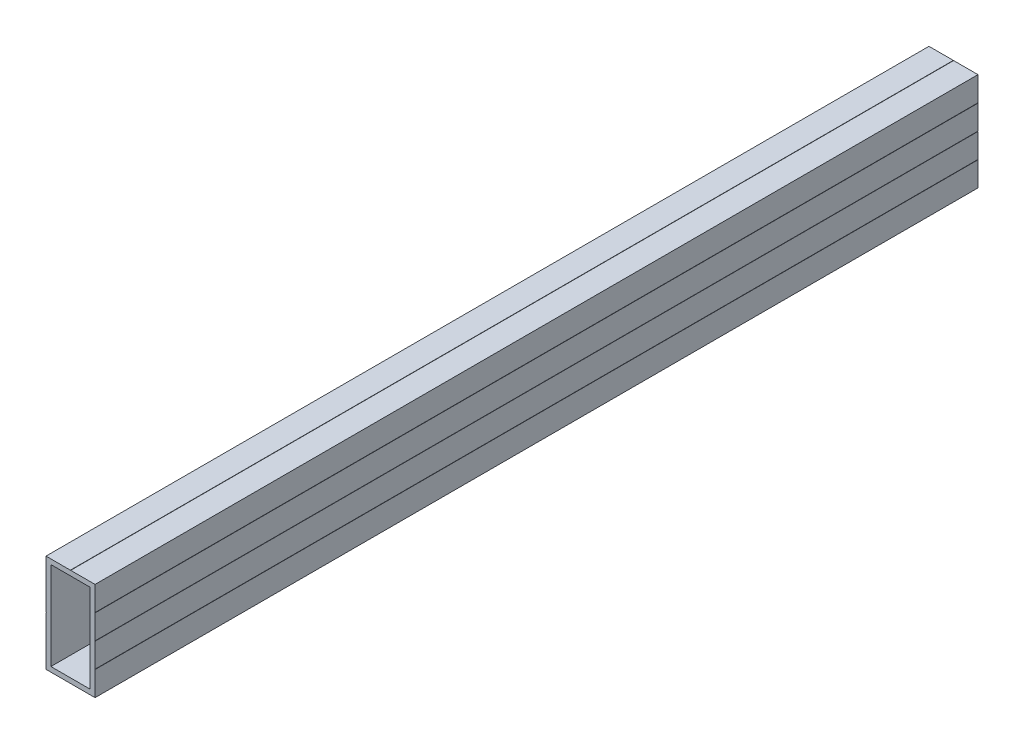
ISO-10303-21;
HEADER;
FILE_DESCRIPTION(('STEP AP214'),'2;1');
FILE_NAME('part.step','',(''),(''),'','','');
FILE_SCHEMA(('AUTOMOTIVE_DESIGN { 1 0 10303 214 1 1 1 1 }'));
ENDSEC;
DATA;
#1=APPLICATION_CONTEXT('core data for automotive mechanical design processes');
#2=APPLICATION_PROTOCOL_DEFINITION('international standard','automotive_design',2000,#1);
#3=PRODUCT_CONTEXT('',#1,'mechanical');
#4=PRODUCT('Part','Part','',(#3));
#5=PRODUCT_RELATED_PRODUCT_CATEGORY('part','',(#4));
#6=PRODUCT_DEFINITION_FORMATION('','',#4);
#7=PRODUCT_DEFINITION_CONTEXT('part definition',#1,'design');
#8=PRODUCT_DEFINITION('design','',#6,#7);
#9=PRODUCT_DEFINITION_SHAPE('','',#8);
#10=(LENGTH_UNIT() NAMED_UNIT(*) SI_UNIT(.MILLI.,.METRE.));
#11=(NAMED_UNIT(*) PLANE_ANGLE_UNIT() SI_UNIT($,.RADIAN.));
#12=(NAMED_UNIT(*) SI_UNIT($,.STERADIAN.) SOLID_ANGLE_UNIT());
#13=UNCERTAINTY_MEASURE_WITH_UNIT(LENGTH_MEASURE(1.E-05),#10,'distance_accuracy_value','');
#14=(GEOMETRIC_REPRESENTATION_CONTEXT(3) GLOBAL_UNCERTAINTY_ASSIGNED_CONTEXT((#13)) GLOBAL_UNIT_ASSIGNED_CONTEXT((#10,
#11,#12)) REPRESENTATION_CONTEXT('',''));
#15=CARTESIAN_POINT('',(0.,0.,0.));
#16=DIRECTION('',(0.,0.,1.));
#17=DIRECTION('',(1.,0.,0.));
#18=AXIS2_PLACEMENT_3D('',#15,#16,#17);
#19=CARTESIAN_POINT('',(-12.7,0.,0.));
#20=DIRECTION('',(1.,0.,0.));
#21=DIRECTION('',(0.,0.,-1.));
#22=AXIS2_PLACEMENT_3D('',#19,#20,#21);
#23=PLANE('',#22);
#24=DIRECTION('',(0.,0.,1.));
#25=VECTOR('',#24,1.);
#26=CARTESIAN_POINT('',(-12.7,25.4,-749.3));
#27=LINE('',#26,#25);
#28=CARTESIAN_POINT('',(-12.7,25.4,292.1));
#29=VERTEX_POINT('',#28);
#30=CARTESIAN_POINT('',(-12.7,25.4,749.3));
#31=VERTEX_POINT('',#30);
#32=EDGE_CURVE('E336',#29,#31,#27,.T.);
#33=ORIENTED_EDGE('',*,*,#32,.F.);
#34=DIRECTION('',(0.,-1.,0.));
#35=VECTOR('',#34,1.);
#36=CARTESIAN_POINT('',(-12.7,0.,292.1));
#37=LINE('',#36,#35);
#38=CARTESIAN_POINT('',(-12.7000000000132,12.7762,292.1));
#39=VERTEX_POINT('',#38);
#40=EDGE_CURVE('E409',#29,#39,#37,.T.);
#41=ORIENTED_EDGE('',*,*,#40,.T.);
#42=DIRECTION('',(0.,0.,1.));
#43=VECTOR('',#42,1.);
#44=CARTESIAN_POINT('',(-12.7000000000132,12.7762,-749.3));
#45=LINE('',#44,#43);
#46=CARTESIAN_POINT('',(-12.7000000000132,12.7762,749.3));
#47=VERTEX_POINT('',#46);
#48=EDGE_CURVE('E272',#39,#47,#45,.T.);
#49=ORIENTED_EDGE('',*,*,#48,.T.);
#50=DIRECTION('',(0.,-1.,0.));
#51=VECTOR('',#50,1.);
#52=CARTESIAN_POINT('',(-12.7,25.4,749.3));
#53=LINE('',#52,#51);
#54=EDGE_CURVE('E340',#31,#47,#53,.T.);
#55=ORIENTED_EDGE('',*,*,#54,.F.);
#56=EDGE_LOOP('',(#33,#41,#49,#55));
#57=FACE_BOUND('',#56,.T.);
#58=ADVANCED_FACE('F35',(#57),#23,.F.);
#59=DIRECTION('',(0.,0.,-1.));
#60=VECTOR('',#59,1.);
#61=CARTESIAN_POINT('',(-12.7,12.6238000000132,0.));
#62=LINE('',#61,#60);
#63=CARTESIAN_POINT('',(-12.7,12.6238000000132,292.1));
#64=VERTEX_POINT('',#63);
#65=CARTESIAN_POINT('',(-12.7,12.6238000000132,749.3));
#66=VERTEX_POINT('',#65);
#67=EDGE_CURVE('E274',#64,#66,#62,.F.);
#68=ORIENTED_EDGE('',*,*,#67,.F.);
#69=DIRECTION('',(0.,-1.,0.));
#70=VECTOR('',#69,1.);
#71=CARTESIAN_POINT('',(-12.7,0.,292.1));
#72=LINE('',#71,#70);
#73=CARTESIAN_POINT('',(-12.7,0.0761999999999976,292.1));
#74=VERTEX_POINT('',#73);
#75=EDGE_CURVE('E50',#64,#74,#72,.T.);
#76=ORIENTED_EDGE('',*,*,#75,.T.);
#77=DIRECTION('',(0.,0.,1.));
#78=VECTOR('',#77,1.);
#79=CARTESIAN_POINT('',(-12.7,0.0761999999999976,-749.3));
#80=LINE('',#79,#78);
#81=CARTESIAN_POINT('',(-12.7,0.0761999999999976,749.3));
#82=VERTEX_POINT('',#81);
#83=EDGE_CURVE('E280',#74,#82,#80,.T.);
#84=ORIENTED_EDGE('',*,*,#83,.T.);
#85=EDGE_CURVE('E344',#66,#82,#53,.T.);
#86=ORIENTED_EDGE('',*,*,#85,.F.);
#87=EDGE_LOOP('',(#68,#76,#84,#86));
#88=FACE_BOUND('',#87,.T.);
#89=ADVANCED_FACE('F514',(#88),#23,.F.);
#90=DIRECTION('',(0.,0.,-1.));
#91=VECTOR('',#90,1.);
#92=CARTESIAN_POINT('',(-12.7,-0.0761999999999985,0.));
#93=LINE('',#92,#91);
#94=CARTESIAN_POINT('',(-12.7,-0.0761999999999982,292.1));
#95=VERTEX_POINT('',#94);
#96=CARTESIAN_POINT('',(-12.7,-0.0761999999999985,749.3));
#97=VERTEX_POINT('',#96);
#98=EDGE_CURVE('E282',#95,#97,#93,.F.);
#99=ORIENTED_EDGE('',*,*,#98,.F.);
#100=DIRECTION('',(0.,-1.,0.));
#101=VECTOR('',#100,1.);
#102=CARTESIAN_POINT('',(-12.7,0.,292.1));
#103=LINE('',#102,#101);
#104=CARTESIAN_POINT('',(-12.7,-12.6238,292.1));
#105=VERTEX_POINT('',#104);
#106=EDGE_CURVE('E431',#95,#105,#103,.T.);
#107=ORIENTED_EDGE('',*,*,#106,.T.);
#108=DIRECTION('',(0.,0.,1.));
#109=VECTOR('',#108,1.);
#110=CARTESIAN_POINT('',(-12.7,-12.6238,-749.3));
#111=LINE('',#110,#109);
#112=CARTESIAN_POINT('',(-12.7,-12.6238,749.3));
#113=VERTEX_POINT('',#112);
#114=EDGE_CURVE('E291',#105,#113,#111,.T.);
#115=ORIENTED_EDGE('',*,*,#114,.T.);
#116=EDGE_CURVE('E597',#97,#113,#53,.T.);
#117=ORIENTED_EDGE('',*,*,#116,.F.);
#118=EDGE_LOOP('',(#99,#107,#115,#117));
#119=FACE_BOUND('',#118,.T.);
#120=ADVANCED_FACE('F506',(#119),#23,.F.);
#121=CARTESIAN_POINT('',(-12.7,-25.4,749.3));
#122=DIRECTION('',(0.,-1.,0.));
#123=DIRECTION('',(0.,0.,-1.));
#124=AXIS2_PLACEMENT_3D('',#121,#122,#123);
#125=PLANE('',#124);
#126=DIRECTION('',(-1.,0.,0.));
#127=VECTOR('',#126,1.);
#128=CARTESIAN_POINT('',(-12.7,-25.4,292.1));
#129=LINE('',#128,#127);
#130=CARTESIAN_POINT('',(-0.0762000000000089,-25.4,292.1));
#131=VERTEX_POINT('',#130);
#132=CARTESIAN_POINT('',(-12.7,-25.4,292.1));
#133=VERTEX_POINT('',#132);
#134=EDGE_CURVE('E453',#131,#133,#129,.T.);
#135=ORIENTED_EDGE('',*,*,#134,.F.);
#136=DIRECTION('',(0.,0.,1.));
#137=VECTOR('',#136,1.);
#138=CARTESIAN_POINT('',(-0.0762000000000087,-25.4,-749.3));
#139=LINE('',#138,#137);
#140=CARTESIAN_POINT('',(-0.0762000000000087,-25.4,749.3));
#141=VERTEX_POINT('',#140);
#142=EDGE_CURVE('E297',#131,#141,#139,.T.);
#143=ORIENTED_EDGE('',*,*,#142,.T.);
#144=DIRECTION('',(1.,0.,0.));
#145=VECTOR('',#144,1.);
#146=CARTESIAN_POINT('',(-12.7,-25.4,749.3));
#147=LINE('',#146,#145);
#148=CARTESIAN_POINT('',(-12.7,-25.4,749.3));
#149=VERTEX_POINT('',#148);
#150=EDGE_CURVE('E43',#149,#141,#147,.T.);
#151=ORIENTED_EDGE('',*,*,#150,.F.);
#152=DIRECTION('',(0.,0.,-1.));
#153=VECTOR('',#152,1.);
#154=CARTESIAN_POINT('',(-12.7,-25.4,749.3));
#155=LINE('',#154,#153);
#156=EDGE_CURVE('E343',#149,#133,#155,.T.);
#157=ORIENTED_EDGE('',*,*,#156,.T.);
#158=EDGE_LOOP('',(#135,#143,#151,#157));
#159=FACE_BOUND('',#158,.T.);
#160=ADVANCED_FACE('F511',(#159),#125,.T.);
#161=CARTESIAN_POINT('',(12.7,0.,0.));
#162=DIRECTION('',(1.,0.,0.));
#163=DIRECTION('',(0.,0.,-1.));
#164=AXIS2_PLACEMENT_3D('',#161,#162,#163);
#165=PLANE('',#164);
#166=DIRECTION('',(0.,-1.,0.));
#167=VECTOR('',#166,1.);
#168=CARTESIAN_POINT('',(12.7,0.,292.1));
#169=LINE('',#168,#167);
#170=CARTESIAN_POINT('',(12.7,-12.7762,292.1));
#171=VERTEX_POINT('',#170);
#172=CARTESIAN_POINT('',(12.7,-25.4,292.1));
#173=VERTEX_POINT('',#172);
#174=EDGE_CURVE('E477',#171,#173,#169,.T.);
#175=ORIENTED_EDGE('',*,*,#174,.F.);
#176=DIRECTION('',(0.,0.,1.));
#177=VECTOR('',#176,1.);
#178=CARTESIAN_POINT('',(12.7,-12.7762,-749.3));
#179=LINE('',#178,#177);
#180=CARTESIAN_POINT('',(12.7,-12.7762,749.3));
#181=VERTEX_POINT('',#180);
#182=EDGE_CURVE('E306',#171,#181,#179,.T.);
#183=ORIENTED_EDGE('',*,*,#182,.T.);
#184=DIRECTION('',(0.,-1.,0.));
#185=VECTOR('',#184,1.);
#186=CARTESIAN_POINT('',(12.7,25.4,749.3));
#187=LINE('',#186,#185);
#188=CARTESIAN_POINT('',(12.7,-25.4,749.3));
#189=VERTEX_POINT('',#188);
#190=EDGE_CURVE('E350',#181,#189,#187,.T.);
#191=ORIENTED_EDGE('',*,*,#190,.T.);
#192=DIRECTION('',(0.,0.,-1.));
#193=VECTOR('',#192,1.);
#194=CARTESIAN_POINT('',(12.7,-25.4,749.3));
#195=LINE('',#194,#193);
#196=EDGE_CURVE('E339',#189,#173,#195,.T.);
#197=ORIENTED_EDGE('',*,*,#196,.T.);
#198=EDGE_LOOP('',(#175,#183,#191,#197));
#199=FACE_BOUND('',#198,.T.);
#200=ADVANCED_FACE('F526',(#199),#165,.T.);
#201=DIRECTION('',(0.,-1.,0.));
#202=VECTOR('',#201,1.);
#203=CARTESIAN_POINT('',(12.7,0.,292.1));
#204=LINE('',#203,#202);
#205=CARTESIAN_POINT('',(12.7,-0.0762000000000003,292.1));
#206=VERTEX_POINT('',#205);
#207=CARTESIAN_POINT('',(12.7,-12.6238,292.1));
#208=VERTEX_POINT('',#207);
#209=EDGE_CURVE('E464',#206,#208,#204,.T.);
#210=ORIENTED_EDGE('',*,*,#209,.F.);
#211=DIRECTION('',(0.,0.,1.));
#212=VECTOR('',#211,1.);
#213=CARTESIAN_POINT('',(12.7,-0.0762000000000003,-749.3));
#214=LINE('',#213,#212);
#215=CARTESIAN_POINT('',(12.7,-0.0762000000000003,749.3));
#216=VERTEX_POINT('',#215);
#217=EDGE_CURVE('E314',#206,#216,#214,.T.);
#218=ORIENTED_EDGE('',*,*,#217,.T.);
#219=CARTESIAN_POINT('',(12.7,-12.6238,749.3));
#220=VERTEX_POINT('',#219);
#221=EDGE_CURVE('E558',#216,#220,#187,.T.);
#222=ORIENTED_EDGE('',*,*,#221,.T.);
#223=DIRECTION('',(0.,0.,-1.));
#224=VECTOR('',#223,1.);
#225=CARTESIAN_POINT('',(12.7,-12.6238,0.));
#226=LINE('',#225,#224);
#227=EDGE_CURVE('E308',#208,#220,#226,.F.);
#228=ORIENTED_EDGE('',*,*,#227,.F.);
#229=EDGE_LOOP('',(#210,#218,#222,#228));
#230=FACE_BOUND('',#229,.T.);
#231=ADVANCED_FACE('F535',(#230),#165,.T.);
#232=DIRECTION('',(0.,-1.,0.));
#233=VECTOR('',#232,1.);
#234=CARTESIAN_POINT('',(12.7,0.,292.1));
#235=LINE('',#234,#233);
#236=CARTESIAN_POINT('',(12.6999999999868,12.6238,292.1));
#237=VERTEX_POINT('',#236);
#238=CARTESIAN_POINT('',(12.7,0.0761999999999985,292.1));
#239=VERTEX_POINT('',#238);
#240=EDGE_CURVE('E451',#237,#239,#235,.T.);
#241=ORIENTED_EDGE('',*,*,#240,.F.);
#242=DIRECTION('',(0.,0.,1.));
#243=VECTOR('',#242,1.);
#244=CARTESIAN_POINT('',(12.6999999999868,12.6238,-749.3));
#245=LINE('',#244,#243);
#246=CARTESIAN_POINT('',(12.6999999999868,12.6238,749.3));
#247=VERTEX_POINT('',#246);
#248=EDGE_CURVE('E325',#237,#247,#245,.T.);
#249=ORIENTED_EDGE('',*,*,#248,.T.);
#250=CARTESIAN_POINT('',(12.7,0.0761999999999985,749.3));
#251=VERTEX_POINT('',#250);
#252=EDGE_CURVE('E354',#247,#251,#187,.T.);
#253=ORIENTED_EDGE('',*,*,#252,.T.);
#254=DIRECTION('',(0.,0.,-1.));
#255=VECTOR('',#254,1.);
#256=CARTESIAN_POINT('',(12.7,0.0761999999999985,0.));
#257=LINE('',#256,#255);
#258=EDGE_CURVE('E316',#239,#251,#257,.F.);
#259=ORIENTED_EDGE('',*,*,#258,.F.);
#260=EDGE_LOOP('',(#241,#249,#253,#259));
#261=FACE_BOUND('',#260,.T.);
#262=ADVANCED_FACE('F527',(#261),#165,.T.);
#263=CARTESIAN_POINT('',(-12.7,25.4,-749.3));
#264=DIRECTION('',(0.,1.,0.));
#265=DIRECTION('',(0.,0.,1.));
#266=AXIS2_PLACEMENT_3D('',#263,#264,#265);
#267=PLANE('',#266);
#268=DIRECTION('',(1.,0.,0.));
#269=VECTOR('',#268,1.);
#270=CARTESIAN_POINT('',(-12.7,25.4,292.1));
#271=LINE('',#270,#269);
#272=CARTESIAN_POINT('',(0.0761999999999968,25.4,292.1));
#273=VERTEX_POINT('',#272);
#274=CARTESIAN_POINT('',(12.7,25.4,292.1));
#275=VERTEX_POINT('',#274);
#276=EDGE_CURVE('E429',#273,#275,#271,.T.);
#277=ORIENTED_EDGE('',*,*,#276,.F.);
#278=DIRECTION('',(0.,0.,1.));
#279=VECTOR('',#278,1.);
#280=CARTESIAN_POINT('',(0.0761999999999968,25.4,-749.3));
#281=LINE('',#280,#279);
#282=CARTESIAN_POINT('',(0.0761999999999968,25.4,749.3));
#283=VERTEX_POINT('',#282);
#284=EDGE_CURVE('E330',#273,#283,#281,.T.);
#285=ORIENTED_EDGE('',*,*,#284,.T.);
#286=DIRECTION('',(1.,0.,0.));
#287=VECTOR('',#286,1.);
#288=CARTESIAN_POINT('',(-12.7,25.4,749.3));
#289=LINE('',#288,#287);
#290=CARTESIAN_POINT('',(12.7,25.4,749.3));
#291=VERTEX_POINT('',#290);
#292=EDGE_CURVE('E347',#283,#291,#289,.T.);
#293=ORIENTED_EDGE('',*,*,#292,.T.);
#294=DIRECTION('',(0.,0.,1.));
#295=VECTOR('',#294,1.);
#296=CARTESIAN_POINT('',(12.7,25.4,-749.3));
#297=LINE('',#296,#295);
#298=EDGE_CURVE('E348',#275,#291,#297,.T.);
#299=ORIENTED_EDGE('',*,*,#298,.F.);
#300=EDGE_LOOP('',(#277,#285,#293,#299));
#301=FACE_BOUND('',#300,.T.);
#302=ADVANCED_FACE('F538',(#301),#267,.T.);
#303=DIRECTION('',(1.,0.,0.));
#304=VECTOR('',#303,1.);
#305=CARTESIAN_POINT('',(-12.7,25.4,292.1));
#306=LINE('',#305,#304);
#307=CARTESIAN_POINT('',(-0.0761999999999985,25.4,292.1));
#308=VERTEX_POINT('',#307);
#309=EDGE_CURVE('E414',#29,#308,#306,.T.);
#310=ORIENTED_EDGE('',*,*,#309,.F.);
#311=ORIENTED_EDGE('',*,*,#32,.T.);
#312=CARTESIAN_POINT('',(-0.0761999999999985,25.4,749.3));
#313=VERTEX_POINT('',#312);
#314=EDGE_CURVE('E360',#31,#313,#289,.T.);
#315=ORIENTED_EDGE('',*,*,#314,.T.);
#316=DIRECTION('',(0.,0.,1.));
#317=VECTOR('',#316,1.);
#318=CARTESIAN_POINT('',(-0.0761999999999985,25.4,-749.3));
#319=LINE('',#318,#317);
#320=EDGE_CURVE('E332',#308,#313,#319,.T.);
#321=ORIENTED_EDGE('',*,*,#320,.F.);
#322=EDGE_LOOP('',(#310,#311,#315,#321));
#323=FACE_BOUND('',#322,.T.);
#324=ADVANCED_FACE('F508',(#323),#267,.T.);
#325=DIRECTION('',(-1.,0.,0.));
#326=VECTOR('',#325,1.);
#327=CARTESIAN_POINT('',(-12.7,-25.4,292.1));
#328=LINE('',#327,#326);
#329=CARTESIAN_POINT('',(0.0761999999999916,-25.4,292.1));
#330=VERTEX_POINT('',#329);
#331=EDGE_CURVE('E475',#173,#330,#328,.T.);
#332=ORIENTED_EDGE('',*,*,#331,.F.);
#333=ORIENTED_EDGE('',*,*,#196,.F.);
#334=CARTESIAN_POINT('',(0.0761999999999898,-25.4,749.3));
#335=VERTEX_POINT('',#334);
#336=EDGE_CURVE('E359',#335,#189,#147,.T.);
#337=ORIENTED_EDGE('',*,*,#336,.F.);
#338=DIRECTION('',(0.,0.,1.));
#339=VECTOR('',#338,1.);
#340=CARTESIAN_POINT('',(0.0761999999999916,-25.4,-749.3));
#341=LINE('',#340,#339);
#342=EDGE_CURVE('E301',#330,#335,#341,.T.);
#343=ORIENTED_EDGE('',*,*,#342,.F.);
#344=EDGE_LOOP('',(#332,#333,#337,#343));
#345=FACE_BOUND('',#344,.T.);
#346=ADVANCED_FACE('F496',(#345),#125,.T.);
#347=CARTESIAN_POINT('',(-12.7,25.4,749.3));
#348=DIRECTION('',(0.,0.,1.));
#349=DIRECTION('',(1.,0.,0.));
#350=AXIS2_PLACEMENT_3D('',#347,#348,#349);
#351=PLANE('',#350);
#352=DIRECTION('',(1.,0.,0.));
#353=VECTOR('',#352,1.);
#354=CARTESIAN_POINT('',(-10.16,-22.86,749.3));
#355=LINE('',#354,#353);
#356=CARTESIAN_POINT('',(-10.16,-22.86,749.3));
#357=VERTEX_POINT('',#356);
#358=CARTESIAN_POINT('',(10.16,-22.86,749.3));
#359=VERTEX_POINT('',#358);
#360=EDGE_CURVE('E479',#357,#359,#355,.T.);
#361=ORIENTED_EDGE('',*,*,#360,.F.);
#362=DIRECTION('',(0.,-1.,0.));
#363=VECTOR('',#362,1.);
#364=CARTESIAN_POINT('',(-10.16,22.86,749.3));
#365=LINE('',#364,#363);
#366=CARTESIAN_POINT('',(-10.16,22.86,749.3));
#367=VERTEX_POINT('',#366);
#368=EDGE_CURVE('E264',#367,#357,#365,.T.);
#369=ORIENTED_EDGE('',*,*,#368,.F.);
#370=DIRECTION('',(-1.,0.,0.));
#371=VECTOR('',#370,1.);
#372=CARTESIAN_POINT('',(10.16,22.86,749.3));
#373=LINE('',#372,#371);
#374=CARTESIAN_POINT('',(10.16,22.86,749.3));
#375=VERTEX_POINT('',#374);
#376=EDGE_CURVE('E483',#375,#367,#373,.T.);
#377=ORIENTED_EDGE('',*,*,#376,.F.);
#378=DIRECTION('',(0.,1.,0.));
#379=VECTOR('',#378,1.);
#380=CARTESIAN_POINT('',(10.16,-22.86,749.3));
#381=LINE('',#380,#379);
#382=EDGE_CURVE('E258',#359,#375,#381,.T.);
#383=ORIENTED_EDGE('',*,*,#382,.F.);
#384=EDGE_LOOP('',(#361,#369,#377,#383));
#385=FACE_BOUND('',#384,.T.);
#386=DIRECTION('',(-0.707106781186539,0.707106781186555,0.));
#387=VECTOR('',#386,1.);
#388=CARTESIAN_POINT('',(-12.5476000000263,12.6238000000132,749.3));
#389=LINE('',#388,#387);
#390=CARTESIAN_POINT('',(-12.6238000000066,12.6999999999934,749.3));
#391=VERTEX_POINT('',#390);
#392=EDGE_CURVE('E268',#391,#47,#389,.T.);
#393=ORIENTED_EDGE('',*,*,#392,.F.);
#394=DIRECTION('',(-0.707106781247692,-0.707106781125403,0.));
#395=VECTOR('',#394,1.);
#396=CARTESIAN_POINT('',(-6.3119000000066,19.0118999989018,749.3));
#397=LINE('',#396,#395);
#398=EDGE_CURVE('E271',#66,#391,#397,.F.);
#399=ORIENTED_EDGE('',*,*,#398,.F.);
#400=ORIENTED_EDGE('',*,*,#85,.T.);
#401=DIRECTION('',(-1.,0.,0.));
#402=VECTOR('',#401,1.);
#403=CARTESIAN_POINT('',(-12.5476,0.0761999999999985,749.3));
#404=LINE('',#403,#402);
#405=CARTESIAN_POINT('',(-12.5475999999737,0.0761999999999985,749.3));
#406=VERTEX_POINT('',#405);
#407=EDGE_CURVE('E275',#406,#82,#404,.T.);
#408=ORIENTED_EDGE('',*,*,#407,.F.);
#409=DIRECTION('',(-0.707106781247692,-0.707106781125403,0.));
#410=VECTOR('',#409,1.);
#411=CARTESIAN_POINT('',(0.0380999999999923,12.661899997797,749.3));
#412=LINE('',#411,#410);
#413=EDGE_CURVE('E278',#97,#406,#412,.F.);
#414=ORIENTED_EDGE('',*,*,#413,.F.);
#415=ORIENTED_EDGE('',*,*,#116,.T.);
#416=DIRECTION('',(-0.707106781186551,0.707106781186543,0.));
#417=VECTOR('',#416,1.);
#418=CARTESIAN_POINT('',(-12.5476,-12.7762,749.3));
#419=LINE('',#418,#417);
#420=CARTESIAN_POINT('',(-12.6238,-12.7,749.3));
#421=VERTEX_POINT('',#420);
#422=EDGE_CURVE('E283',#421,#113,#419,.T.);
#423=ORIENTED_EDGE('',*,*,#422,.F.);
#424=DIRECTION('',(-0.707106781186537,-0.707106781186558,0.));
#425=VECTOR('',#424,1.);
#426=CARTESIAN_POINT('',(6.38809999999999,6.31190000000056,749.3));
#427=LINE('',#426,#425);
#428=CARTESIAN_POINT('',(-12.7,-12.7762,749.3));
#429=VERTEX_POINT('',#428);
#430=EDGE_CURVE('E286',#429,#421,#427,.F.);
#431=ORIENTED_EDGE('',*,*,#430,.F.);
#432=EDGE_CURVE('E338',#429,#149,#53,.T.);
#433=ORIENTED_EDGE('',*,*,#432,.T.);
#434=ORIENTED_EDGE('',*,*,#150,.T.);
#435=DIRECTION('',(0.707106781186552,0.707106781186544,0.));
#436=VECTOR('',#435,1.);
#437=CARTESIAN_POINT('',(19.0118999999999,-6.31190000000029,749.3));
#438=LINE('',#437,#436);
#439=CARTESIAN_POINT('',(0.,-25.3238,749.3));
#440=VERTEX_POINT('',#439);
#441=EDGE_CURVE('E296',#440,#141,#438,.F.);
#442=ORIENTED_EDGE('',*,*,#441,.F.);
#443=DIRECTION('',(-0.707106781186547,0.707106781186548,0.));
#444=VECTOR('',#443,1.);
#445=CARTESIAN_POINT('',(0.0761999999999916,-25.4,749.3));
#446=LINE('',#445,#444);
#447=EDGE_CURVE('E293',#335,#440,#446,.T.);
#448=ORIENTED_EDGE('',*,*,#447,.F.);
#449=ORIENTED_EDGE('',*,*,#336,.T.);
#450=ORIENTED_EDGE('',*,*,#190,.F.);
#451=DIRECTION('',(0.707106781186539,-0.707106781186556,0.));
#452=VECTOR('',#451,1.);
#453=CARTESIAN_POINT('',(12.5476,-12.6238,749.3));
#454=LINE('',#453,#452);
#455=CARTESIAN_POINT('',(12.6238,-12.7,749.3));
#456=VERTEX_POINT('',#455);
#457=EDGE_CURVE('E299',#456,#181,#454,.T.);
#458=ORIENTED_EDGE('',*,*,#457,.F.);
#459=DIRECTION('',(0.707106781186553,0.707106781186542,0.));
#460=VECTOR('',#459,1.);
#461=CARTESIAN_POINT('',(19.0118999999998,-6.3119000000003,749.3));
#462=LINE('',#461,#460);
#463=EDGE_CURVE('E305',#220,#456,#462,.F.);
#464=ORIENTED_EDGE('',*,*,#463,.F.);
#465=ORIENTED_EDGE('',*,*,#221,.F.);
#466=DIRECTION('',(1.,0.,0.));
#467=VECTOR('',#466,1.);
#468=CARTESIAN_POINT('',(12.5476,-0.0761999999999985,749.3));
#469=LINE('',#468,#467);
#470=CARTESIAN_POINT('',(12.5476,-0.0761999999999985,749.3));
#471=VERTEX_POINT('',#470);
#472=EDGE_CURVE('E309',#471,#216,#469,.T.);
#473=ORIENTED_EDGE('',*,*,#472,.F.);
#474=DIRECTION('',(0.707106781186553,0.707106781186542,0.));
#475=VECTOR('',#474,1.);
#476=CARTESIAN_POINT('',(12.6618999999998,0.038099999999798,749.3));
#477=LINE('',#476,#475);
#478=EDGE_CURVE('E312',#251,#471,#477,.F.);
#479=ORIENTED_EDGE('',*,*,#478,.F.);
#480=ORIENTED_EDGE('',*,*,#252,.F.);
#481=DIRECTION('',(0.707106781186544,-0.707106781186552,0.));
#482=VECTOR('',#481,1.);
#483=CARTESIAN_POINT('',(12.5475999999736,12.7762000000132,749.3));
#484=LINE('',#483,#482);
#485=CARTESIAN_POINT('',(12.6237999999868,12.7,749.3));
#486=VERTEX_POINT('',#485);
#487=EDGE_CURVE('E317',#486,#247,#484,.T.);
#488=ORIENTED_EDGE('',*,*,#487,.F.);
#489=DIRECTION('',(0.707106781125415,0.707106781247681,0.));
#490=VECTOR('',#489,1.);
#491=CARTESIAN_POINT('',(6.31190000218278,6.38810000110456,749.3));
#492=LINE('',#491,#490);
#493=CARTESIAN_POINT('',(12.6999999999868,12.7762000000132,749.3));
#494=VERTEX_POINT('',#493);
#495=EDGE_CURVE('E320',#494,#486,#492,.F.);
#496=ORIENTED_EDGE('',*,*,#495,.F.);
#497=EDGE_CURVE('E351',#291,#494,#187,.T.);
#498=ORIENTED_EDGE('',*,*,#497,.F.);
#499=ORIENTED_EDGE('',*,*,#292,.F.);
#500=DIRECTION('',(-0.707106781186552,-0.707106781186543,0.));
#501=VECTOR('',#500,1.);
#502=CARTESIAN_POINT('',(-6.31190000000008,19.0119,749.3));
#503=LINE('',#502,#501);
#504=CARTESIAN_POINT('',(0.,25.3238,749.3));
#505=VERTEX_POINT('',#504);
#506=EDGE_CURVE('E331',#505,#283,#503,.F.);
#507=ORIENTED_EDGE('',*,*,#506,.F.);
#508=DIRECTION('',(0.707106781186548,-0.707106781186547,0.));
#509=VECTOR('',#508,1.);
#510=CARTESIAN_POINT('',(-0.0761999999999985,25.4,749.3));
#511=LINE('',#510,#509);
#512=EDGE_CURVE('E327',#313,#505,#511,.T.);
#513=ORIENTED_EDGE('',*,*,#512,.F.);
#514=ORIENTED_EDGE('',*,*,#314,.F.);
#515=ORIENTED_EDGE('',*,*,#54,.T.);
#516=EDGE_LOOP('',(#393,#399,#400,#408,#414,#415,#423,#431,#433,#434,#442,#448,#449,#450,#458,
#464,#465,#473,#479,#480,#488,#496,#498,#499,#507,#513,#514,#515));
#517=FACE_BOUND('',#516,.T.);
#518=ADVANCED_FACE('F402',(#385,#517),#351,.T.);
#519=DIRECTION('',(0.,0.,1.));
#520=VECTOR('',#519,1.);
#521=CARTESIAN_POINT('',(-12.7,-12.7762,-749.3));
#522=LINE('',#521,#520);
#523=CARTESIAN_POINT('',(-12.7,-12.7762,292.1));
#524=VERTEX_POINT('',#523);
#525=EDGE_CURVE('E288',#524,#429,#522,.T.);
#526=ORIENTED_EDGE('',*,*,#525,.F.);
#527=DIRECTION('',(0.,-1.,0.));
#528=VECTOR('',#527,1.);
#529=CARTESIAN_POINT('',(-12.7,0.,292.1));
#530=LINE('',#529,#528);
#531=EDGE_CURVE('E448',#524,#133,#530,.T.);
#532=ORIENTED_EDGE('',*,*,#531,.T.);
#533=ORIENTED_EDGE('',*,*,#156,.F.);
#534=ORIENTED_EDGE('',*,*,#432,.F.);
#535=EDGE_LOOP('',(#526,#532,#533,#534));
#536=FACE_BOUND('',#535,.T.);
#537=ADVANCED_FACE('F495',(#536),#23,.F.);
#538=DIRECTION('',(0.,-1.,0.));
#539=VECTOR('',#538,1.);
#540=CARTESIAN_POINT('',(12.7,0.,292.1));
#541=LINE('',#540,#539);
#542=CARTESIAN_POINT('',(12.7,12.7762000000132,292.1));
#543=VERTEX_POINT('',#542);
#544=EDGE_CURVE('E437',#275,#543,#541,.T.);
#545=ORIENTED_EDGE('',*,*,#544,.F.);
#546=ORIENTED_EDGE('',*,*,#298,.T.);
#547=ORIENTED_EDGE('',*,*,#497,.T.);
#548=DIRECTION('',(0.,0.,1.));
#549=VECTOR('',#548,1.);
#550=CARTESIAN_POINT('',(12.6999999999868,12.7762000000132,-749.3));
#551=LINE('',#550,#549);
#552=EDGE_CURVE('E322',#543,#494,#551,.T.);
#553=ORIENTED_EDGE('',*,*,#552,.F.);
#554=EDGE_LOOP('',(#545,#546,#547,#553));
#555=FACE_BOUND('',#554,.T.);
#556=ADVANCED_FACE('F503',(#555),#165,.T.);
#557=CARTESIAN_POINT('',(0.0761999999999968,25.4,-749.3));
#558=DIRECTION('',(-0.707106781186543,0.707106781186552,0.));
#559=DIRECTION('',(-0.707106781186552,-0.707106781186543,0.));
#560=AXIS2_PLACEMENT_3D('',#557,#558,#559);
#561=PLANE('',#560);
#562=ORIENTED_EDGE('',*,*,#284,.F.);
#563=DIRECTION('',(0.707106781186552,0.707106781186543,0.));
#564=VECTOR('',#563,1.);
#565=CARTESIAN_POINT('',(0.0761999999999968,25.4,292.1));
#566=LINE('',#565,#564);
#567=CARTESIAN_POINT('',(0.,25.3238,292.1));
#568=VERTEX_POINT('',#567);
#569=EDGE_CURVE('E426',#273,#568,#566,.F.);
#570=ORIENTED_EDGE('',*,*,#569,.T.);
#571=DIRECTION('',(0.,0.,-1.));
#572=VECTOR('',#571,1.);
#573=CARTESIAN_POINT('',(0.,25.3238,-749.3));
#574=LINE('',#573,#572);
#575=EDGE_CURVE('E334',#568,#505,#574,.F.);
#576=ORIENTED_EDGE('',*,*,#575,.T.);
#577=ORIENTED_EDGE('',*,*,#506,.T.);
#578=EDGE_LOOP('',(#562,#570,#576,#577));
#579=FACE_BOUND('',#578,.T.);
#580=ADVANCED_FACE('F524',(#579),#561,.T.);
#581=CARTESIAN_POINT('',(-0.0761999999999985,25.4,-749.3));
#582=DIRECTION('',(-0.707106781186547,-0.707106781186547,0.));
#583=DIRECTION('',(0.707106781186548,-0.707106781186548,0.));
#584=AXIS2_PLACEMENT_3D('',#581,#582,#583);
#585=PLANE('',#584);
#586=ORIENTED_EDGE('',*,*,#575,.F.);
#587=DIRECTION('',(-0.707106781186548,0.707106781186548,0.));
#588=VECTOR('',#587,1.);
#589=CARTESIAN_POINT('',(-0.0761999999999985,25.4,292.1));
#590=LINE('',#589,#588);
#591=EDGE_CURVE('E423',#568,#308,#590,.T.);
#592=ORIENTED_EDGE('',*,*,#591,.T.);
#593=ORIENTED_EDGE('',*,*,#320,.T.);
#594=ORIENTED_EDGE('',*,*,#512,.T.);
#595=EDGE_LOOP('',(#586,#592,#593,#594));
#596=FACE_BOUND('',#595,.T.);
#597=ADVANCED_FACE('F521',(#596),#585,.F.);
#598=CARTESIAN_POINT('',(12.5475999999736,12.7762000000132,-749.3));
#599=DIRECTION('',(-0.707106781186551,-0.707106781186544,0.));
#600=DIRECTION('',(0.707106781186544,-0.707106781186551,0.));
#601=AXIS2_PLACEMENT_3D('',#598,#599,#600);
#602=PLANE('',#601);
#603=ORIENTED_EDGE('',*,*,#248,.F.);
#604=DIRECTION('',(-0.707106781186544,0.707106781186551,0.));
#605=VECTOR('',#604,1.);
#606=CARTESIAN_POINT('',(12.5475999999736,12.7762000000132,292.1));
#607=LINE('',#606,#605);
#608=CARTESIAN_POINT('',(12.6237999999868,12.7,292.1));
#609=VERTEX_POINT('',#608);
#610=EDGE_CURVE('E445',#237,#609,#607,.T.);
#611=ORIENTED_EDGE('',*,*,#610,.T.);
#612=DIRECTION('',(0.,0.,-1.));
#613=VECTOR('',#612,1.);
#614=CARTESIAN_POINT('',(12.6237999999868,12.7,-749.3));
#615=LINE('',#614,#613);
#616=EDGE_CURVE('E324',#609,#486,#615,.F.);
#617=ORIENTED_EDGE('',*,*,#616,.T.);
#618=ORIENTED_EDGE('',*,*,#487,.T.);
#619=EDGE_LOOP('',(#603,#611,#617,#618));
#620=FACE_BOUND('',#619,.T.);
#621=ADVANCED_FACE('F551',(#620),#602,.F.);
#622=CARTESIAN_POINT('',(12.6999999999868,12.7762000000132,-749.3));
#623=DIRECTION('',(0.70710678124768,-0.707106781125414,0.));
#624=DIRECTION('',(0.707106781125415,0.707106781247681,0.));
#625=AXIS2_PLACEMENT_3D('',#622,#623,#624);
#626=PLANE('',#625);
#627=ORIENTED_EDGE('',*,*,#616,.F.);
#628=DIRECTION('',(-0.707106781125415,-0.707106781247681,0.));
#629=VECTOR('',#628,1.);
#630=CARTESIAN_POINT('',(12.6999999999868,12.7762000000132,292.1));
#631=LINE('',#630,#629);
#632=EDGE_CURVE('E442',#609,#543,#631,.F.);
#633=ORIENTED_EDGE('',*,*,#632,.T.);
#634=ORIENTED_EDGE('',*,*,#552,.T.);
#635=ORIENTED_EDGE('',*,*,#495,.T.);
#636=EDGE_LOOP('',(#627,#633,#634,#635));
#637=FACE_BOUND('',#636,.T.);
#638=ADVANCED_FACE('F628',(#637),#626,.T.);
#639=CARTESIAN_POINT('',(12.5476,-0.0761999999999985,-749.3));
#640=DIRECTION('',(0.,-1.,0.));
#641=DIRECTION('',(1.,0.,0.));
#642=AXIS2_PLACEMENT_3D('',#639,#640,#641);
#643=PLANE('',#642);
#644=ORIENTED_EDGE('',*,*,#217,.F.);
#645=DIRECTION('',(-1.,0.,0.));
#646=VECTOR('',#645,1.);
#647=CARTESIAN_POINT('',(12.5476,-0.0761999999999985,292.1));
#648=LINE('',#647,#646);
#649=CARTESIAN_POINT('',(12.5476,-0.0761999999999975,292.1));
#650=VERTEX_POINT('',#649);
#651=EDGE_CURVE('E461',#206,#650,#648,.T.);
#652=ORIENTED_EDGE('',*,*,#651,.T.);
#653=DIRECTION('',(0.,0.,-1.));
#654=VECTOR('',#653,1.);
#655=CARTESIAN_POINT('',(12.5476,-0.0761999999999985,0.));
#656=LINE('',#655,#654);
#657=EDGE_CURVE('E321',#650,#471,#656,.F.);
#658=ORIENTED_EDGE('',*,*,#657,.T.);
#659=ORIENTED_EDGE('',*,*,#472,.T.);
#660=EDGE_LOOP('',(#644,#652,#658,#659));
#661=FACE_BOUND('',#660,.T.);
#662=ADVANCED_FACE('F626',(#661),#643,.F.);
#663=CARTESIAN_POINT('',(12.7,0.0761999999999985,0.));
#664=DIRECTION('',(0.707106781186542,-0.707106781186553,0.));
#665=DIRECTION('',(0.707106781186553,0.707106781186542,0.));
#666=AXIS2_PLACEMENT_3D('',#663,#664,#665);
#667=PLANE('',#666);
#668=ORIENTED_EDGE('',*,*,#657,.F.);
#669=DIRECTION('',(-0.707106781186553,-0.707106781186542,0.));
#670=VECTOR('',#669,1.);
#671=CARTESIAN_POINT('',(12.7,0.0761999999999985,292.1));
#672=LINE('',#671,#670);
#673=EDGE_CURVE('E458',#650,#239,#672,.F.);
#674=ORIENTED_EDGE('',*,*,#673,.T.);
#675=ORIENTED_EDGE('',*,*,#258,.T.);
#676=ORIENTED_EDGE('',*,*,#478,.T.);
#677=EDGE_LOOP('',(#668,#674,#675,#676));
#678=FACE_BOUND('',#677,.T.);
#679=ADVANCED_FACE('F624',(#678),#667,.T.);
#680=CARTESIAN_POINT('',(12.5476,-12.6238,-749.3));
#681=DIRECTION('',(-0.707106781186555,-0.707106781186539,0.));
#682=DIRECTION('',(0.70710678118654,-0.707106781186556,0.));
#683=AXIS2_PLACEMENT_3D('',#680,#681,#682);
#684=PLANE('',#683);
#685=ORIENTED_EDGE('',*,*,#182,.F.);
#686=DIRECTION('',(-0.70710678118654,0.707106781186556,0.));
#687=VECTOR('',#686,1.);
#688=CARTESIAN_POINT('',(12.5476,-12.6238,292.1));
#689=LINE('',#688,#687);
#690=CARTESIAN_POINT('',(12.6238,-12.7,292.1));
#691=VERTEX_POINT('',#690);
#692=EDGE_CURVE('E472',#171,#691,#689,.T.);
#693=ORIENTED_EDGE('',*,*,#692,.T.);
#694=DIRECTION('',(0.,0.,-1.));
#695=VECTOR('',#694,1.);
#696=CARTESIAN_POINT('',(12.6238,-12.7,0.));
#697=LINE('',#696,#695);
#698=EDGE_CURVE('E313',#691,#456,#697,.F.);
#699=ORIENTED_EDGE('',*,*,#698,.T.);
#700=ORIENTED_EDGE('',*,*,#457,.T.);
#701=EDGE_LOOP('',(#685,#693,#699,#700));
#702=FACE_BOUND('',#701,.T.);
#703=ADVANCED_FACE('F620',(#702),#684,.F.);
#704=CARTESIAN_POINT('',(12.7,-12.6238,0.));
#705=DIRECTION('',(0.707106781186542,-0.707106781186553,0.));
#706=DIRECTION('',(0.707106781186553,0.707106781186542,0.));
#707=AXIS2_PLACEMENT_3D('',#704,#705,#706);
#708=PLANE('',#707);
#709=ORIENTED_EDGE('',*,*,#698,.F.);
#710=DIRECTION('',(-0.707106781186553,-0.707106781186542,0.));
#711=VECTOR('',#710,1.);
#712=CARTESIAN_POINT('',(12.7,-12.6238,292.1));
#713=LINE('',#712,#711);
#714=EDGE_CURVE('E469',#691,#208,#713,.F.);
#715=ORIENTED_EDGE('',*,*,#714,.T.);
#716=ORIENTED_EDGE('',*,*,#227,.T.);
#717=ORIENTED_EDGE('',*,*,#463,.T.);
#718=EDGE_LOOP('',(#709,#715,#716,#717));
#719=FACE_BOUND('',#718,.T.);
#720=ADVANCED_FACE('F623',(#719),#708,.T.);
#721=CARTESIAN_POINT('',(-0.0762000000000087,-25.4,-749.3));
#722=DIRECTION('',(0.707106781186543,-0.707106781186551,0.));
#723=DIRECTION('',(0.707106781186552,0.707106781186544,0.));
#724=AXIS2_PLACEMENT_3D('',#721,#722,#723);
#725=PLANE('',#724);
#726=ORIENTED_EDGE('',*,*,#142,.F.);
#727=DIRECTION('',(-0.707106781186552,-0.707106781186544,0.));
#728=VECTOR('',#727,1.);
#729=CARTESIAN_POINT('',(-0.0762000000000087,-25.4,292.1));
#730=LINE('',#729,#728);
#731=CARTESIAN_POINT('',(0.,-25.3238,292.1));
#732=VERTEX_POINT('',#731);
#733=EDGE_CURVE('E455',#131,#732,#730,.F.);
#734=ORIENTED_EDGE('',*,*,#733,.T.);
#735=DIRECTION('',(0.,0.,-1.));
#736=VECTOR('',#735,1.);
#737=CARTESIAN_POINT('',(0.,-25.3238,-749.3));
#738=LINE('',#737,#736);
#739=EDGE_CURVE('E300',#732,#440,#738,.F.);
#740=ORIENTED_EDGE('',*,*,#739,.T.);
#741=ORIENTED_EDGE('',*,*,#441,.T.);
#742=EDGE_LOOP('',(#726,#734,#740,#741));
#743=FACE_BOUND('',#742,.T.);
#744=ADVANCED_FACE('F578',(#743),#725,.T.);
#745=CARTESIAN_POINT('',(0.0761999999999916,-25.4,-749.3));
#746=DIRECTION('',(0.707106781186548,0.707106781186547,0.));
#747=DIRECTION('',(-0.707106781186547,0.707106781186548,0.));
#748=AXIS2_PLACEMENT_3D('',#745,#746,#747);
#749=PLANE('',#748);
#750=ORIENTED_EDGE('',*,*,#739,.F.);
#751=DIRECTION('',(0.707106781186547,-0.707106781186548,0.));
#752=VECTOR('',#751,1.);
#753=CARTESIAN_POINT('',(0.0761999999999916,-25.4,292.1));
#754=LINE('',#753,#752);
#755=EDGE_CURVE('E466',#732,#330,#754,.T.);
#756=ORIENTED_EDGE('',*,*,#755,.T.);
#757=ORIENTED_EDGE('',*,*,#342,.T.);
#758=ORIENTED_EDGE('',*,*,#447,.T.);
#759=EDGE_LOOP('',(#750,#756,#757,#758));
#760=FACE_BOUND('',#759,.T.);
#761=ADVANCED_FACE('F573',(#760),#749,.F.);
#762=CARTESIAN_POINT('',(-12.5476,-12.7762,-749.3));
#763=DIRECTION('',(0.707106781186543,0.707106781186551,0.));
#764=DIRECTION('',(-0.707106781186552,0.707106781186544,0.));
#765=AXIS2_PLACEMENT_3D('',#762,#763,#764);
#766=PLANE('',#765);
#767=ORIENTED_EDGE('',*,*,#114,.F.);
#768=DIRECTION('',(0.707106781186552,-0.707106781186544,0.));
#769=VECTOR('',#768,1.);
#770=CARTESIAN_POINT('',(-12.5476,-12.7762,292.1));
#771=LINE('',#770,#769);
#772=CARTESIAN_POINT('',(-12.6238,-12.7,292.1));
#773=VERTEX_POINT('',#772);
#774=EDGE_CURVE('E434',#105,#773,#771,.T.);
#775=ORIENTED_EDGE('',*,*,#774,.T.);
#776=DIRECTION('',(0.,0.,-1.));
#777=VECTOR('',#776,1.);
#778=CARTESIAN_POINT('',(-12.6238,-12.7,-749.3));
#779=LINE('',#778,#777);
#780=EDGE_CURVE('E290',#773,#421,#779,.F.);
#781=ORIENTED_EDGE('',*,*,#780,.T.);
#782=ORIENTED_EDGE('',*,*,#422,.T.);
#783=EDGE_LOOP('',(#767,#775,#781,#782));
#784=FACE_BOUND('',#783,.T.);
#785=ADVANCED_FACE('F592',(#784),#766,.F.);
#786=CARTESIAN_POINT('',(-12.7,-12.7762,-749.3));
#787=DIRECTION('',(-0.707106781186558,0.707106781186537,0.));
#788=DIRECTION('',(-0.707106781186537,-0.707106781186558,0.));
#789=AXIS2_PLACEMENT_3D('',#786,#787,#788);
#790=PLANE('',#789);
#791=ORIENTED_EDGE('',*,*,#780,.F.);
#792=DIRECTION('',(0.707106781186537,0.707106781186558,0.));
#793=VECTOR('',#792,1.);
#794=CARTESIAN_POINT('',(-12.7,-12.7762,292.1));
#795=LINE('',#794,#793);
#796=EDGE_CURVE('E439',#773,#524,#795,.F.);
#797=ORIENTED_EDGE('',*,*,#796,.T.);
#798=ORIENTED_EDGE('',*,*,#525,.T.);
#799=ORIENTED_EDGE('',*,*,#430,.T.);
#800=EDGE_LOOP('',(#791,#797,#798,#799));
#801=FACE_BOUND('',#800,.T.);
#802=ADVANCED_FACE('F587',(#801),#790,.T.);
#803=CARTESIAN_POINT('',(-12.5476,0.0761999999999985,-749.3));
#804=DIRECTION('',(0.,1.,0.));
#805=DIRECTION('',(-1.,0.,0.));
#806=AXIS2_PLACEMENT_3D('',#803,#804,#805);
#807=PLANE('',#806);
#808=ORIENTED_EDGE('',*,*,#83,.F.);
#809=DIRECTION('',(1.,0.,0.));
#810=VECTOR('',#809,1.);
#811=CARTESIAN_POINT('',(-12.5476,0.0761999999999985,292.1));
#812=LINE('',#811,#810);
#813=CARTESIAN_POINT('',(-12.5475999999737,0.0761999999999985,292.1));
#814=VERTEX_POINT('',#813);
#815=EDGE_CURVE('E411',#74,#814,#812,.T.);
#816=ORIENTED_EDGE('',*,*,#815,.T.);
#817=DIRECTION('',(0.,0.,-1.));
#818=VECTOR('',#817,1.);
#819=CARTESIAN_POINT('',(-12.5475999999737,0.0761999999999985,0.));
#820=LINE('',#819,#818);
#821=EDGE_CURVE('E287',#814,#406,#820,.F.);
#822=ORIENTED_EDGE('',*,*,#821,.T.);
#823=ORIENTED_EDGE('',*,*,#407,.T.);
#824=EDGE_LOOP('',(#808,#816,#822,#823));
#825=FACE_BOUND('',#824,.T.);
#826=ADVANCED_FACE('F605',(#825),#807,.F.);
#827=CARTESIAN_POINT('',(-12.7,-0.0761999999999985,0.));
#828=DIRECTION('',(-0.707106781125403,0.707106781247692,0.));
#829=DIRECTION('',(-0.707106781247692,-0.707106781125403,0.));
#830=AXIS2_PLACEMENT_3D('',#827,#828,#829);
#831=PLANE('',#830);
#832=ORIENTED_EDGE('',*,*,#821,.F.);
#833=DIRECTION('',(0.707106781247692,0.707106781125403,0.));
#834=VECTOR('',#833,1.);
#835=CARTESIAN_POINT('',(-12.7,-0.0761999999999985,292.1));
#836=LINE('',#835,#834);
#837=EDGE_CURVE('E420',#814,#95,#836,.F.);
#838=ORIENTED_EDGE('',*,*,#837,.T.);
#839=ORIENTED_EDGE('',*,*,#98,.T.);
#840=ORIENTED_EDGE('',*,*,#413,.T.);
#841=EDGE_LOOP('',(#832,#838,#839,#840));
#842=FACE_BOUND('',#841,.T.);
#843=ADVANCED_FACE('F601',(#842),#831,.T.);
#844=CARTESIAN_POINT('',(-12.5476000000263,12.6238000000132,-749.3));
#845=DIRECTION('',(0.707106781186556,0.70710678118654,0.));
#846=DIRECTION('',(-0.707106781186539,0.707106781186556,0.));
#847=AXIS2_PLACEMENT_3D('',#844,#845,#846);
#848=PLANE('',#847);
#849=ORIENTED_EDGE('',*,*,#48,.F.);
#850=DIRECTION('',(0.707106781186539,-0.707106781186556,0.));
#851=VECTOR('',#850,1.);
#852=CARTESIAN_POINT('',(-12.5476000000263,12.6238000000132,292.1));
#853=LINE('',#852,#851);
#854=CARTESIAN_POINT('',(-12.6238000000066,12.6999999999934,292.1));
#855=VERTEX_POINT('',#854);
#856=EDGE_CURVE('E395',#39,#855,#853,.T.);
#857=ORIENTED_EDGE('',*,*,#856,.T.);
#858=DIRECTION('',(0.,0.,-1.));
#859=VECTOR('',#858,1.);
#860=CARTESIAN_POINT('',(-12.6238000000066,12.6999999999934,0.));
#861=LINE('',#860,#859);
#862=EDGE_CURVE('E279',#855,#391,#861,.F.);
#863=ORIENTED_EDGE('',*,*,#862,.T.);
#864=ORIENTED_EDGE('',*,*,#392,.T.);
#865=EDGE_LOOP('',(#849,#857,#863,#864));
#866=FACE_BOUND('',#865,.T.);
#867=ADVANCED_FACE('F393',(#866),#848,.F.);
#868=CARTESIAN_POINT('',(-12.7,12.6238000000132,0.));
#869=DIRECTION('',(-0.707106781125403,0.707106781247692,0.));
#870=DIRECTION('',(-0.707106781247692,-0.707106781125403,0.));
#871=AXIS2_PLACEMENT_3D('',#868,#869,#870);
#872=PLANE('',#871);
#873=ORIENTED_EDGE('',*,*,#862,.F.);
#874=DIRECTION('',(0.707106781247692,0.707106781125403,0.));
#875=VECTOR('',#874,1.);
#876=CARTESIAN_POINT('',(-12.7,12.6238000000132,292.1));
#877=LINE('',#876,#875);
#878=EDGE_CURVE('E867',#855,#64,#877,.F.);
#879=ORIENTED_EDGE('',*,*,#878,.T.);
#880=ORIENTED_EDGE('',*,*,#67,.T.);
#881=ORIENTED_EDGE('',*,*,#398,.T.);
#882=EDGE_LOOP('',(#873,#879,#880,#881));
#883=FACE_BOUND('',#882,.T.);
#884=ADVANCED_FACE('F37',(#883),#872,.T.);
#885=CARTESIAN_POINT('',(-10.16,-22.86,-749.3));
#886=DIRECTION('',(0.,-1.,0.));
#887=DIRECTION('',(0.,0.,-1.));
#888=AXIS2_PLACEMENT_3D('',#885,#886,#887);
#889=PLANE('',#888);
#890=DIRECTION('',(0.,0.,1.));
#891=VECTOR('',#890,1.);
#892=CARTESIAN_POINT('',(10.16,-22.86,-749.3));
#893=LINE('',#892,#891);
#894=CARTESIAN_POINT('',(10.16,-22.86,292.099999999999));
#895=VERTEX_POINT('',#894);
#896=EDGE_CURVE('E260',#895,#359,#893,.T.);
#897=ORIENTED_EDGE('',*,*,#896,.F.);
#898=DIRECTION('',(-1.,0.,0.));
#899=VECTOR('',#898,1.);
#900=CARTESIAN_POINT('',(-10.16,-22.86,292.1));
#901=LINE('',#900,#899);
#902=CARTESIAN_POINT('',(-10.16,-22.86,292.1));
#903=VERTEX_POINT('',#902);
#904=EDGE_CURVE('E58',#895,#903,#901,.T.);
#905=ORIENTED_EDGE('',*,*,#904,.T.);
#906=DIRECTION('',(0.,0.,1.));
#907=VECTOR('',#906,1.);
#908=CARTESIAN_POINT('',(-10.16,-22.86,-749.3));
#909=LINE('',#908,#907);
#910=EDGE_CURVE('E262',#903,#357,#909,.T.);
#911=ORIENTED_EDGE('',*,*,#910,.T.);
#912=ORIENTED_EDGE('',*,*,#360,.T.);
#913=EDGE_LOOP('',(#897,#905,#911,#912));
#914=FACE_BOUND('',#913,.T.);
#915=ADVANCED_FACE('F488',(#914),#889,.F.);
#916=CARTESIAN_POINT('',(-10.16,22.86,-749.3));
#917=DIRECTION('',(-1.,0.,0.));
#918=DIRECTION('',(0.,0.,1.));
#919=AXIS2_PLACEMENT_3D('',#916,#917,#918);
#920=PLANE('',#919);
#921=ORIENTED_EDGE('',*,*,#910,.F.);
#922=DIRECTION('',(0.,1.,0.));
#923=VECTOR('',#922,1.);
#924=CARTESIAN_POINT('',(-10.16,22.86,292.1));
#925=LINE('',#924,#923);
#926=CARTESIAN_POINT('',(-10.16,22.86,292.1));
#927=VERTEX_POINT('',#926);
#928=EDGE_CURVE('E254',#903,#927,#925,.T.);
#929=ORIENTED_EDGE('',*,*,#928,.T.);
#930=DIRECTION('',(0.,0.,1.));
#931=VECTOR('',#930,1.);
#932=CARTESIAN_POINT('',(-10.16,22.86,-749.3));
#933=LINE('',#932,#931);
#934=EDGE_CURVE('E253',#927,#367,#933,.T.);
#935=ORIENTED_EDGE('',*,*,#934,.T.);
#936=ORIENTED_EDGE('',*,*,#368,.T.);
#937=EDGE_LOOP('',(#921,#929,#935,#936));
#938=FACE_BOUND('',#937,.T.);
#939=ADVANCED_FACE('F492',(#938),#920,.F.);
#940=CARTESIAN_POINT('',(10.16,22.86,-749.3));
#941=DIRECTION('',(0.,1.,0.));
#942=DIRECTION('',(0.,0.,1.));
#943=AXIS2_PLACEMENT_3D('',#940,#941,#942);
#944=PLANE('',#943);
#945=ORIENTED_EDGE('',*,*,#934,.F.);
#946=DIRECTION('',(1.,0.,0.));
#947=VECTOR('',#946,1.);
#948=CARTESIAN_POINT('',(10.16,22.86,292.1));
#949=LINE('',#948,#947);
#950=CARTESIAN_POINT('',(10.16,22.86,292.1));
#951=VERTEX_POINT('',#950);
#952=EDGE_CURVE('E242',#927,#951,#949,.T.);
#953=ORIENTED_EDGE('',*,*,#952,.T.);
#954=DIRECTION('',(0.,0.,1.));
#955=VECTOR('',#954,1.);
#956=CARTESIAN_POINT('',(10.16,22.86,-749.3));
#957=LINE('',#956,#955);
#958=EDGE_CURVE('E251',#951,#375,#957,.T.);
#959=ORIENTED_EDGE('',*,*,#958,.T.);
#960=ORIENTED_EDGE('',*,*,#376,.T.);
#961=EDGE_LOOP('',(#945,#953,#959,#960));
#962=FACE_BOUND('',#961,.T.);
#963=ADVANCED_FACE('F249',(#962),#944,.F.);
#964=CARTESIAN_POINT('',(10.16,-22.86,-749.3));
#965=DIRECTION('',(1.,0.,0.));
#966=DIRECTION('',(0.,0.,-1.));
#967=AXIS2_PLACEMENT_3D('',#964,#965,#966);
#968=PLANE('',#967);
#969=ORIENTED_EDGE('',*,*,#958,.F.);
#970=DIRECTION('',(0.,-1.,0.));
#971=VECTOR('',#970,1.);
#972=CARTESIAN_POINT('',(10.16,-22.86,292.1));
#973=LINE('',#972,#971);
#974=EDGE_CURVE('E11',#951,#895,#973,.T.);
#975=ORIENTED_EDGE('',*,*,#974,.T.);
#976=ORIENTED_EDGE('',*,*,#896,.T.);
#977=ORIENTED_EDGE('',*,*,#382,.T.);
#978=EDGE_LOOP('',(#969,#975,#976,#977));
#979=FACE_BOUND('',#978,.T.);
#980=ADVANCED_FACE('F256',(#979),#968,.F.);
#981=CARTESIAN_POINT('',(0.,0.,292.1));
#982=DIRECTION('',(0.,0.,1.));
#983=DIRECTION('',(1.,0.,0.));
#984=AXIS2_PLACEMENT_3D('',#981,#982,#983);
#985=PLANE('',#984);
#986=ORIENTED_EDGE('',*,*,#174,.T.);
#987=ORIENTED_EDGE('',*,*,#331,.T.);
#988=ORIENTED_EDGE('',*,*,#755,.F.);
#989=ORIENTED_EDGE('',*,*,#733,.F.);
#990=ORIENTED_EDGE('',*,*,#134,.T.);
#991=ORIENTED_EDGE('',*,*,#531,.F.);
#992=ORIENTED_EDGE('',*,*,#796,.F.);
#993=ORIENTED_EDGE('',*,*,#774,.F.);
#994=ORIENTED_EDGE('',*,*,#106,.F.);
#995=ORIENTED_EDGE('',*,*,#837,.F.);
#996=ORIENTED_EDGE('',*,*,#815,.F.);
#997=ORIENTED_EDGE('',*,*,#75,.F.);
#998=ORIENTED_EDGE('',*,*,#878,.F.);
#999=ORIENTED_EDGE('',*,*,#856,.F.);
#1000=ORIENTED_EDGE('',*,*,#40,.F.);
#1001=ORIENTED_EDGE('',*,*,#309,.T.);
#1002=ORIENTED_EDGE('',*,*,#591,.F.);
#1003=ORIENTED_EDGE('',*,*,#569,.F.);
#1004=ORIENTED_EDGE('',*,*,#276,.T.);
#1005=ORIENTED_EDGE('',*,*,#544,.T.);
#1006=ORIENTED_EDGE('',*,*,#632,.F.);
#1007=ORIENTED_EDGE('',*,*,#610,.F.);
#1008=ORIENTED_EDGE('',*,*,#240,.T.);
#1009=ORIENTED_EDGE('',*,*,#673,.F.);
#1010=ORIENTED_EDGE('',*,*,#651,.F.);
#1011=ORIENTED_EDGE('',*,*,#209,.T.);
#1012=ORIENTED_EDGE('',*,*,#714,.F.);
#1013=ORIENTED_EDGE('',*,*,#692,.F.);
#1014=EDGE_LOOP('',(#986,#987,#988,#989,#990,#991,#992,#993,#994,#995,#996,#997,#998,#999,#1000,
#1001,#1002,#1003,#1004,#1005,#1006,#1007,#1008,#1009,#1010,#1011,#1012,#1013));
#1015=FACE_BOUND('',#1014,.T.);
#1016=ORIENTED_EDGE('',*,*,#974,.F.);
#1017=ORIENTED_EDGE('',*,*,#952,.F.);
#1018=ORIENTED_EDGE('',*,*,#928,.F.);
#1019=ORIENTED_EDGE('',*,*,#904,.F.);
#1020=EDGE_LOOP('',(#1016,#1017,#1018,#1019));
#1021=FACE_BOUND('',#1020,.T.);
#1022=ADVANCED_FACE('F241',(#1015,#1021),#985,.F.);
#1023=CLOSED_SHELL('',(#58,#89,#120,#160,#200,#231,#262,#302,#324,#346,#518,#537,#556,#580,#597,
#621,#638,#662,#679,#703,#720,#744,#761,#785,#802,#826,#843,#867,#884,#915,#939,#963,#980,#1022));
#1024=MANIFOLD_SOLID_BREP('B2',#1023);
#1025=ADVANCED_BREP_SHAPE_REPRESENTATION('',(#18,#1024),#14);
#1026=SHAPE_DEFINITION_REPRESENTATION(#9,#1025);
ENDSEC;
END-ISO-10303-21;
